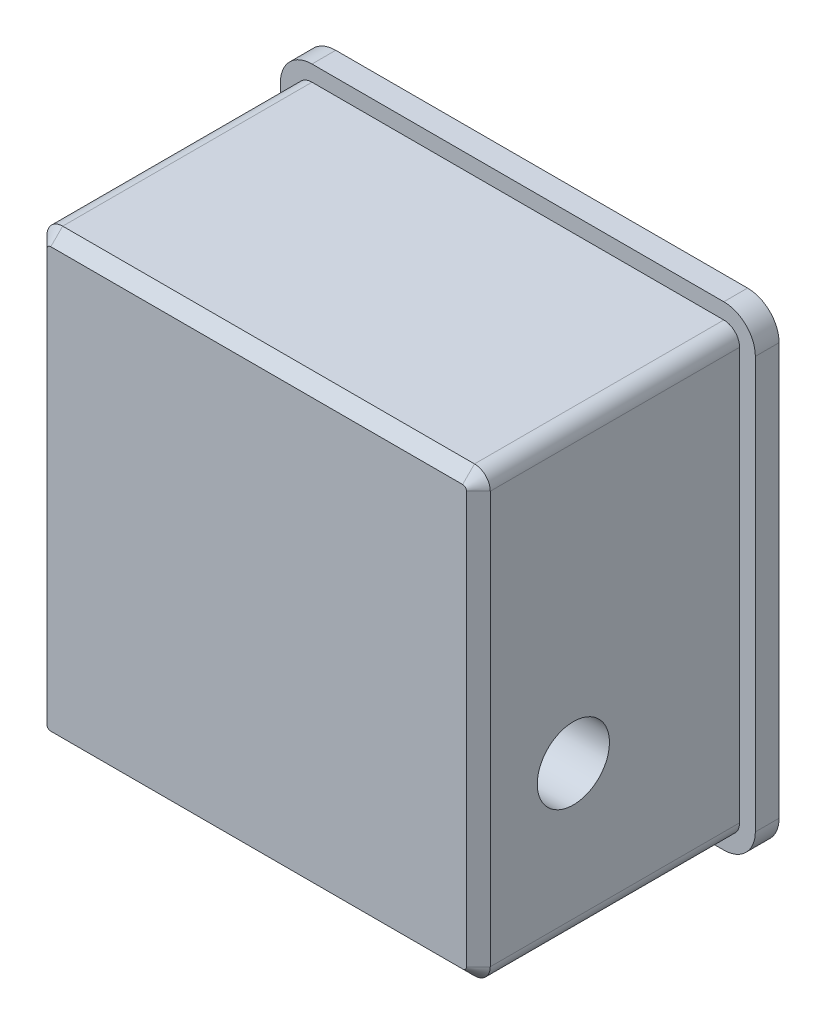
ISO-10303-21;
HEADER;
FILE_DESCRIPTION(('STEP AP214'),'2;1');
FILE_NAME('part.step','',(''),(''),'','','');
FILE_SCHEMA(('AUTOMOTIVE_DESIGN { 1 0 10303 214 1 1 1 1 }'));
ENDSEC;
DATA;
#1=APPLICATION_CONTEXT('core data for automotive mechanical design processes');
#2=APPLICATION_PROTOCOL_DEFINITION('international standard','automotive_design',2000,#1);
#3=PRODUCT_CONTEXT('',#1,'mechanical');
#4=PRODUCT('Part','Part','',(#3));
#5=PRODUCT_RELATED_PRODUCT_CATEGORY('part','',(#4));
#6=PRODUCT_DEFINITION_FORMATION('','',#4);
#7=PRODUCT_DEFINITION_CONTEXT('part definition',#1,'design');
#8=PRODUCT_DEFINITION('design','',#6,#7);
#9=PRODUCT_DEFINITION_SHAPE('','',#8);
#10=(LENGTH_UNIT() NAMED_UNIT(*) SI_UNIT(.MILLI.,.METRE.));
#11=(NAMED_UNIT(*) PLANE_ANGLE_UNIT() SI_UNIT($,.RADIAN.));
#12=(NAMED_UNIT(*) SI_UNIT($,.STERADIAN.) SOLID_ANGLE_UNIT());
#13=UNCERTAINTY_MEASURE_WITH_UNIT(LENGTH_MEASURE(1.E-05),#10,'distance_accuracy_value','');
#14=(GEOMETRIC_REPRESENTATION_CONTEXT(3) GLOBAL_UNCERTAINTY_ASSIGNED_CONTEXT((#13)) GLOBAL_UNIT_ASSIGNED_CONTEXT((#10,
#11,#12)) REPRESENTATION_CONTEXT('',''));
#15=CARTESIAN_POINT('',(0.,0.,0.));
#16=DIRECTION('',(0.,0.,1.));
#17=DIRECTION('',(1.,0.,0.));
#18=AXIS2_PLACEMENT_3D('',#15,#16,#17);
#19=CARTESIAN_POINT('',(27.5336,27.5336,38.1));
#20=DIRECTION('',(0.,0.,-1.));
#21=DIRECTION('',(-1.,0.,0.));
#22=AXIS2_PLACEMENT_3D('',#19,#20,#21);
#23=CYLINDRICAL_SURFACE('',#22,2.1082);
#24=DIRECTION('',(0.,0.,-1.));
#25=VECTOR('',#24,1.);
#26=CARTESIAN_POINT('',(27.5336,29.6418,38.1));
#27=LINE('',#26,#25);
#28=CARTESIAN_POINT('',(27.5336,29.6418,36.5125));
#29=VERTEX_POINT('',#28);
#30=CARTESIAN_POINT('',(27.5336,29.6418,3.175));
#31=VERTEX_POINT('',#30);
#32=EDGE_CURVE('E191',#29,#31,#27,.T.);
#33=ORIENTED_EDGE('',*,*,#32,.F.);
#34=CARTESIAN_POINT('',(27.5336,27.5336,36.5125));
#35=DIRECTION('',(0.,0.,1.));
#36=DIRECTION('',(1.,0.,0.));
#37=AXIS2_PLACEMENT_3D('',#34,#35,#36);
#38=CIRCLE('',#37,2.1082);
#39=CARTESIAN_POINT('',(29.6418,27.5336,36.5125));
#40=VERTEX_POINT('',#39);
#41=EDGE_CURVE('E325',#29,#40,#38,.F.);
#42=ORIENTED_EDGE('',*,*,#41,.T.);
#43=DIRECTION('',(0.,0.,-1.));
#44=VECTOR('',#43,1.);
#45=CARTESIAN_POINT('',(29.6418,27.5336,38.1));
#46=LINE('',#45,#44);
#47=CARTESIAN_POINT('',(29.6418,27.5336,3.17500000000001));
#48=VERTEX_POINT('',#47);
#49=EDGE_CURVE('E215',#40,#48,#46,.T.);
#50=ORIENTED_EDGE('',*,*,#49,.T.);
#51=CARTESIAN_POINT('',(27.5336,27.5336,3.175));
#52=DIRECTION('',(0.,0.,1.));
#53=DIRECTION('',(-1.,0.,0.));
#54=AXIS2_PLACEMENT_3D('',#51,#52,#53);
#55=CIRCLE('',#54,2.1082);
#56=EDGE_CURVE('E208',#48,#31,#55,.T.);
#57=ORIENTED_EDGE('',*,*,#56,.T.);
#58=EDGE_LOOP('',(#33,#42,#50,#57));
#59=FACE_BOUND('',#58,.T.);
#60=ADVANCED_FACE('F51',(#59),#23,.T.);
#61=CARTESIAN_POINT('',(0.,29.6418,38.1));
#62=DIRECTION('',(0.,-1.,0.));
#63=DIRECTION('',(0.,0.,-1.));
#64=AXIS2_PLACEMENT_3D('',#61,#62,#63);
#65=PLANE('',#64);
#66=DIRECTION('',(0.,0.,-1.));
#67=VECTOR('',#66,1.);
#68=CARTESIAN_POINT('',(-27.5336,29.6418,38.1));
#69=LINE('',#68,#67);
#70=CARTESIAN_POINT('',(-27.5336,29.6418,36.5125));
#71=VERTEX_POINT('',#70);
#72=CARTESIAN_POINT('',(-27.5336,29.6418,3.175));
#73=VERTEX_POINT('',#72);
#74=EDGE_CURVE('E201',#71,#73,#69,.T.);
#75=ORIENTED_EDGE('',*,*,#74,.F.);
#76=DIRECTION('',(1.,0.,0.));
#77=VECTOR('',#76,1.);
#78=CARTESIAN_POINT('',(27.5336,29.6418,36.5125));
#79=LINE('',#78,#77);
#80=EDGE_CURVE('E197',#71,#29,#79,.T.);
#81=ORIENTED_EDGE('',*,*,#80,.T.);
#82=ORIENTED_EDGE('',*,*,#32,.T.);
#83=DIRECTION('',(-1.,0.,0.));
#84=VECTOR('',#83,1.);
#85=CARTESIAN_POINT('',(27.5336,29.6418,3.175));
#86=LINE('',#85,#84);
#87=EDGE_CURVE('E195',#31,#73,#86,.T.);
#88=ORIENTED_EDGE('',*,*,#87,.T.);
#89=EDGE_LOOP('',(#75,#81,#82,#88));
#90=FACE_BOUND('',#89,.T.);
#91=ADVANCED_FACE('F194',(#90),#65,.F.);
#92=CARTESIAN_POINT('',(-27.5336,27.5336,38.1));
#93=DIRECTION('',(0.,0.,-1.));
#94=DIRECTION('',(-1.,0.,0.));
#95=AXIS2_PLACEMENT_3D('',#92,#93,#94);
#96=CYLINDRICAL_SURFACE('',#95,2.1082);
#97=DIRECTION('',(0.,0.,-1.));
#98=VECTOR('',#97,1.);
#99=CARTESIAN_POINT('',(-29.6418,27.5336,38.1));
#100=LINE('',#99,#98);
#101=CARTESIAN_POINT('',(-29.6418,27.5336,36.5125));
#102=VERTEX_POINT('',#101);
#103=CARTESIAN_POINT('',(-29.6418,27.5336,3.175));
#104=VERTEX_POINT('',#103);
#105=EDGE_CURVE('E305',#102,#104,#100,.T.);
#106=ORIENTED_EDGE('',*,*,#105,.F.);
#107=CARTESIAN_POINT('',(-27.5336,27.5336,36.5125));
#108=DIRECTION('',(0.,0.,1.));
#109=DIRECTION('',(1.,0.,0.));
#110=AXIS2_PLACEMENT_3D('',#107,#108,#109);
#111=CIRCLE('',#110,2.1082);
#112=EDGE_CURVE('E327',#102,#71,#111,.F.);
#113=ORIENTED_EDGE('',*,*,#112,.T.);
#114=ORIENTED_EDGE('',*,*,#74,.T.);
#115=CARTESIAN_POINT('',(-27.5336,27.5336,3.175));
#116=DIRECTION('',(0.,0.,1.));
#117=DIRECTION('',(1.,0.,0.));
#118=AXIS2_PLACEMENT_3D('',#115,#116,#117);
#119=CIRCLE('',#118,2.1082);
#120=EDGE_CURVE('E212',#73,#104,#119,.T.);
#121=ORIENTED_EDGE('',*,*,#120,.T.);
#122=EDGE_LOOP('',(#106,#113,#114,#121));
#123=FACE_BOUND('',#122,.T.);
#124=ADVANCED_FACE('F402',(#123),#96,.T.);
#125=CARTESIAN_POINT('',(-29.6418,0.,38.1));
#126=DIRECTION('',(1.,0.,0.));
#127=DIRECTION('',(0.,0.,-1.));
#128=AXIS2_PLACEMENT_3D('',#125,#126,#127);
#129=PLANE('',#128);
#130=CARTESIAN_POINT('',(-29.6418,-9.52500000000002,25.4));
#131=DIRECTION('',(1.,0.,0.));
#132=DIRECTION('',(0.,0.,-1.));
#133=AXIS2_PLACEMENT_3D('',#130,#131,#132);
#134=CIRCLE('',#133,4.826);
#135=CARTESIAN_POINT('',(-29.6418,-9.52500000000002,20.574));
#136=VERTEX_POINT('',#135);
#137=EDGE_CURVE('E216',#136,#136,#134,.T.);
#138=ORIENTED_EDGE('',*,*,#137,.T.);
#139=EDGE_LOOP('',(#138));
#140=FACE_BOUND('',#139,.T.);
#141=DIRECTION('',(0.,0.,-1.));
#142=VECTOR('',#141,1.);
#143=CARTESIAN_POINT('',(-29.6418,-27.5336,38.1));
#144=LINE('',#143,#142);
#145=CARTESIAN_POINT('',(-29.6418,-27.5336,36.5125));
#146=VERTEX_POINT('',#145);
#147=CARTESIAN_POINT('',(-29.6418,-27.5336,3.175));
#148=VERTEX_POINT('',#147);
#149=EDGE_CURVE('E303',#146,#148,#144,.T.);
#150=ORIENTED_EDGE('',*,*,#149,.F.);
#151=DIRECTION('',(0.,1.,0.));
#152=VECTOR('',#151,1.);
#153=CARTESIAN_POINT('',(-29.6418,27.5336,36.5125));
#154=LINE('',#153,#152);
#155=EDGE_CURVE('E331',#146,#102,#154,.T.);
#156=ORIENTED_EDGE('',*,*,#155,.T.);
#157=ORIENTED_EDGE('',*,*,#105,.T.);
#158=DIRECTION('',(0.,-1.,0.));
#159=VECTOR('',#158,1.);
#160=CARTESIAN_POINT('',(-29.6418,27.5336,3.175));
#161=LINE('',#160,#159);
#162=EDGE_CURVE('E224',#104,#148,#161,.T.);
#163=ORIENTED_EDGE('',*,*,#162,.T.);
#164=EDGE_LOOP('',(#150,#156,#157,#163));
#165=FACE_BOUND('',#164,.T.);
#166=ADVANCED_FACE('F544',(#140,#165),#129,.F.);
#167=CARTESIAN_POINT('',(-27.5336,-27.5336,38.1));
#168=DIRECTION('',(0.,0.,-1.));
#169=DIRECTION('',(-1.,0.,0.));
#170=AXIS2_PLACEMENT_3D('',#167,#168,#169);
#171=CYLINDRICAL_SURFACE('',#170,2.1082);
#172=DIRECTION('',(0.,0.,-1.));
#173=VECTOR('',#172,1.);
#174=CARTESIAN_POINT('',(-27.5336,-29.6418,38.1));
#175=LINE('',#174,#173);
#176=CARTESIAN_POINT('',(-27.5336,-29.6418,36.5125));
#177=VERTEX_POINT('',#176);
#178=CARTESIAN_POINT('',(-27.5336,-29.6418,3.175));
#179=VERTEX_POINT('',#178);
#180=EDGE_CURVE('E301',#177,#179,#175,.T.);
#181=ORIENTED_EDGE('',*,*,#180,.F.);
#182=CARTESIAN_POINT('',(-27.5336,-27.5336,36.5125));
#183=DIRECTION('',(0.,0.,1.));
#184=DIRECTION('',(1.,0.,0.));
#185=AXIS2_PLACEMENT_3D('',#182,#183,#184);
#186=CIRCLE('',#185,2.1082);
#187=EDGE_CURVE('E61',#177,#146,#186,.F.);
#188=ORIENTED_EDGE('',*,*,#187,.T.);
#189=ORIENTED_EDGE('',*,*,#149,.T.);
#190=CARTESIAN_POINT('',(-27.5336,-27.5336,3.175));
#191=DIRECTION('',(0.,0.,1.));
#192=DIRECTION('',(-1.,0.,0.));
#193=AXIS2_PLACEMENT_3D('',#190,#191,#192);
#194=CIRCLE('',#193,2.1082);
#195=EDGE_CURVE('E227',#148,#179,#194,.T.);
#196=ORIENTED_EDGE('',*,*,#195,.T.);
#197=EDGE_LOOP('',(#181,#188,#189,#196));
#198=FACE_BOUND('',#197,.T.);
#199=ADVANCED_FACE('F537',(#198),#171,.T.);
#200=CARTESIAN_POINT('',(0.,-29.6418,38.1));
#201=DIRECTION('',(0.,-1.,0.));
#202=DIRECTION('',(1.,0.,0.));
#203=AXIS2_PLACEMENT_3D('',#200,#201,#202);
#204=PLANE('',#203);
#205=DIRECTION('',(0.,0.,-1.));
#206=VECTOR('',#205,1.);
#207=CARTESIAN_POINT('',(27.5336,-29.6418,38.1));
#208=LINE('',#207,#206);
#209=CARTESIAN_POINT('',(27.5336,-29.6418,36.5125));
#210=VERTEX_POINT('',#209);
#211=CARTESIAN_POINT('',(27.5336,-29.6418,3.175));
#212=VERTEX_POINT('',#211);
#213=EDGE_CURVE('E299',#210,#212,#208,.T.);
#214=ORIENTED_EDGE('',*,*,#213,.F.);
#215=DIRECTION('',(-1.,0.,0.));
#216=VECTOR('',#215,1.);
#217=CARTESIAN_POINT('',(0.,-29.6418,36.5125));
#218=LINE('',#217,#216);
#219=EDGE_CURVE('E11',#210,#177,#218,.T.);
#220=ORIENTED_EDGE('',*,*,#219,.T.);
#221=ORIENTED_EDGE('',*,*,#180,.T.);
#222=DIRECTION('',(1.,0.,0.));
#223=VECTOR('',#222,1.);
#224=CARTESIAN_POINT('',(27.5336,-29.6418,3.175));
#225=LINE('',#224,#223);
#226=EDGE_CURVE('E230',#179,#212,#225,.T.);
#227=ORIENTED_EDGE('',*,*,#226,.T.);
#228=EDGE_LOOP('',(#214,#220,#221,#227));
#229=FACE_BOUND('',#228,.T.);
#230=ADVANCED_FACE('F530',(#229),#204,.T.);
#231=CARTESIAN_POINT('',(27.5336,-27.5336,38.1));
#232=DIRECTION('',(0.,0.,-1.));
#233=DIRECTION('',(-1.,0.,0.));
#234=AXIS2_PLACEMENT_3D('',#231,#232,#233);
#235=CYLINDRICAL_SURFACE('',#234,2.1082);
#236=DIRECTION('',(0.,0.,-1.));
#237=VECTOR('',#236,1.);
#238=CARTESIAN_POINT('',(29.6418,-27.5336,38.1));
#239=LINE('',#238,#237);
#240=CARTESIAN_POINT('',(29.6418,-27.5336,36.5125));
#241=VERTEX_POINT('',#240);
#242=CARTESIAN_POINT('',(29.6418,-27.5336,3.175));
#243=VERTEX_POINT('',#242);
#244=EDGE_CURVE('E297',#241,#243,#239,.T.);
#245=ORIENTED_EDGE('',*,*,#244,.F.);
#246=CARTESIAN_POINT('',(27.5336,-27.5336,36.5125));
#247=DIRECTION('',(0.,0.,1.));
#248=DIRECTION('',(1.,0.,0.));
#249=AXIS2_PLACEMENT_3D('',#246,#247,#248);
#250=CIRCLE('',#249,2.1082);
#251=EDGE_CURVE('E75',#241,#210,#250,.F.);
#252=ORIENTED_EDGE('',*,*,#251,.T.);
#253=ORIENTED_EDGE('',*,*,#213,.T.);
#254=CARTESIAN_POINT('',(27.5336,-27.5336,3.175));
#255=DIRECTION('',(0.,0.,1.));
#256=DIRECTION('',(-1.,0.,0.));
#257=AXIS2_PLACEMENT_3D('',#254,#255,#256);
#258=CIRCLE('',#257,2.1082);
#259=EDGE_CURVE('E233',#212,#243,#258,.T.);
#260=ORIENTED_EDGE('',*,*,#259,.T.);
#261=EDGE_LOOP('',(#245,#252,#253,#260));
#262=FACE_BOUND('',#261,.T.);
#263=ADVANCED_FACE('F370',(#262),#235,.T.);
#264=CARTESIAN_POINT('',(29.6418,0.,38.1));
#265=DIRECTION('',(1.,0.,0.));
#266=DIRECTION('',(0.,1.,0.));
#267=AXIS2_PLACEMENT_3D('',#264,#265,#266);
#268=PLANE('',#267);
#269=CARTESIAN_POINT('',(29.6418,-9.525,25.4));
#270=DIRECTION('',(1.,0.,0.));
#271=DIRECTION('',(0.,1.,0.));
#272=AXIS2_PLACEMENT_3D('',#269,#270,#271);
#273=CIRCLE('',#272,4.826);
#274=CARTESIAN_POINT('',(29.6418,-4.699,25.4));
#275=VERTEX_POINT('',#274);
#276=EDGE_CURVE('E219',#275,#275,#273,.T.);
#277=ORIENTED_EDGE('',*,*,#276,.F.);
#278=EDGE_LOOP('',(#277));
#279=FACE_BOUND('',#278,.T.);
#280=ORIENTED_EDGE('',*,*,#49,.F.);
#281=DIRECTION('',(0.,-1.,0.));
#282=VECTOR('',#281,1.);
#283=CARTESIAN_POINT('',(29.6418,0.,36.5125));
#284=LINE('',#283,#282);
#285=EDGE_CURVE('E329',#40,#241,#284,.T.);
#286=ORIENTED_EDGE('',*,*,#285,.T.);
#287=ORIENTED_EDGE('',*,*,#244,.T.);
#288=DIRECTION('',(0.,1.,0.));
#289=VECTOR('',#288,1.);
#290=CARTESIAN_POINT('',(29.6418,27.5336,3.175));
#291=LINE('',#290,#289);
#292=EDGE_CURVE('E236',#243,#48,#291,.T.);
#293=ORIENTED_EDGE('',*,*,#292,.T.);
#294=EDGE_LOOP('',(#280,#286,#287,#293));
#295=FACE_BOUND('',#294,.T.);
#296=ADVANCED_FACE('F366',(#279,#295),#268,.T.);
#297=CARTESIAN_POINT('',(0.,0.,38.1));
#298=DIRECTION('',(0.,0.,1.));
#299=DIRECTION('',(1.,0.,0.));
#300=AXIS2_PLACEMENT_3D('',#297,#298,#299);
#301=PLANE('',#300);
#302=CARTESIAN_POINT('',(27.5336,27.5336,38.1));
#303=DIRECTION('',(0.,0.,1.));
#304=DIRECTION('',(1.,0.,0.));
#305=AXIS2_PLACEMENT_3D('',#302,#303,#304);
#306=CIRCLE('',#305,0.520699999999982);
#307=CARTESIAN_POINT('',(28.0543,27.5336,38.1));
#308=VERTEX_POINT('',#307);
#309=CARTESIAN_POINT('',(27.5336,28.0543,38.1));
#310=VERTEX_POINT('',#309);
#311=EDGE_CURVE('E319',#308,#310,#306,.T.);
#312=ORIENTED_EDGE('',*,*,#311,.T.);
#313=DIRECTION('',(-1.,0.,0.));
#314=VECTOR('',#313,1.);
#315=CARTESIAN_POINT('',(-27.5336,28.0543,38.1));
#316=LINE('',#315,#314);
#317=CARTESIAN_POINT('',(-27.5336,28.0543,38.1));
#318=VERTEX_POINT('',#317);
#319=EDGE_CURVE('E321',#310,#318,#316,.T.);
#320=ORIENTED_EDGE('',*,*,#319,.T.);
#321=CARTESIAN_POINT('',(-27.5336,27.5336,38.1));
#322=DIRECTION('',(0.,0.,1.));
#323=DIRECTION('',(1.,0.,0.));
#324=AXIS2_PLACEMENT_3D('',#321,#322,#323);
#325=CIRCLE('',#324,0.520699999999982);
#326=CARTESIAN_POINT('',(-28.0543,27.5336,38.1));
#327=VERTEX_POINT('',#326);
#328=EDGE_CURVE('E317',#318,#327,#325,.T.);
#329=ORIENTED_EDGE('',*,*,#328,.T.);
#330=DIRECTION('',(0.,-1.,0.));
#331=VECTOR('',#330,1.);
#332=CARTESIAN_POINT('',(-28.0543,-27.5336,38.1));
#333=LINE('',#332,#331);
#334=CARTESIAN_POINT('',(-28.0543,-27.5336,38.1));
#335=VERTEX_POINT('',#334);
#336=EDGE_CURVE('E313',#327,#335,#333,.T.);
#337=ORIENTED_EDGE('',*,*,#336,.T.);
#338=CARTESIAN_POINT('',(-27.5336,-27.5336,38.1));
#339=DIRECTION('',(0.,0.,1.));
#340=DIRECTION('',(1.,0.,0.));
#341=AXIS2_PLACEMENT_3D('',#338,#339,#340);
#342=CIRCLE('',#341,0.520699999999982);
#343=CARTESIAN_POINT('',(-27.5336,-28.0543,38.1));
#344=VERTEX_POINT('',#343);
#345=EDGE_CURVE('E309',#335,#344,#342,.T.);
#346=ORIENTED_EDGE('',*,*,#345,.T.);
#347=DIRECTION('',(1.,0.,0.));
#348=VECTOR('',#347,1.);
#349=CARTESIAN_POINT('',(0.,-28.0543,38.1));
#350=LINE('',#349,#348);
#351=CARTESIAN_POINT('',(27.5336,-28.0543,38.1));
#352=VERTEX_POINT('',#351);
#353=EDGE_CURVE('E200',#344,#352,#350,.T.);
#354=ORIENTED_EDGE('',*,*,#353,.T.);
#355=CARTESIAN_POINT('',(27.5336,-27.5336,38.1));
#356=DIRECTION('',(0.,0.,1.));
#357=DIRECTION('',(1.,0.,0.));
#358=AXIS2_PLACEMENT_3D('',#355,#356,#357);
#359=CIRCLE('',#358,0.520699999999982);
#360=CARTESIAN_POINT('',(28.0543,-27.5336,38.1));
#361=VERTEX_POINT('',#360);
#362=EDGE_CURVE('E311',#352,#361,#359,.T.);
#363=ORIENTED_EDGE('',*,*,#362,.T.);
#364=DIRECTION('',(0.,1.,0.));
#365=VECTOR('',#364,1.);
#366=CARTESIAN_POINT('',(28.0543,0.,38.1));
#367=LINE('',#366,#365);
#368=EDGE_CURVE('E315',#361,#308,#367,.T.);
#369=ORIENTED_EDGE('',*,*,#368,.T.);
#370=EDGE_LOOP('',(#312,#320,#329,#337,#346,#354,#363,#369));
#371=FACE_BOUND('',#370,.T.);
#372=ADVANCED_FACE('F369',(#371),#301,.T.);
#373=CARTESIAN_POINT('',(-27.5336,-27.5336,3.175));
#374=DIRECTION('',(0.,0.,-1.));
#375=DIRECTION('',(-1.,0.,0.));
#376=AXIS2_PLACEMENT_3D('',#373,#374,#375);
#377=PLANE('',#376);
#378=CARTESIAN_POINT('',(-27.5336,-27.5336,3.175));
#379=DIRECTION('',(0.,0.,1.));
#380=DIRECTION('',(-1.,0.,0.));
#381=AXIS2_PLACEMENT_3D('',#378,#379,#380);
#382=CIRCLE('',#381,4.2164);
#383=CARTESIAN_POINT('',(-31.75,-27.5336,3.175));
#384=VERTEX_POINT('',#383);
#385=CARTESIAN_POINT('',(-27.5336,-31.75,3.175));
#386=VERTEX_POINT('',#385);
#387=EDGE_CURVE('E239',#384,#386,#382,.T.);
#388=ORIENTED_EDGE('',*,*,#387,.T.);
#389=DIRECTION('',(1.,0.,0.));
#390=VECTOR('',#389,1.);
#391=CARTESIAN_POINT('',(27.5336,-31.75,3.175));
#392=LINE('',#391,#390);
#393=CARTESIAN_POINT('',(27.5336,-31.75,3.175));
#394=VERTEX_POINT('',#393);
#395=EDGE_CURVE('E242',#386,#394,#392,.T.);
#396=ORIENTED_EDGE('',*,*,#395,.T.);
#397=CARTESIAN_POINT('',(27.5336,-27.5336,3.175));
#398=DIRECTION('',(0.,0.,1.));
#399=DIRECTION('',(-1.,0.,0.));
#400=AXIS2_PLACEMENT_3D('',#397,#398,#399);
#401=CIRCLE('',#400,4.2164);
#402=CARTESIAN_POINT('',(31.75,-27.5336,3.175));
#403=VERTEX_POINT('',#402);
#404=EDGE_CURVE('E245',#394,#403,#401,.T.);
#405=ORIENTED_EDGE('',*,*,#404,.T.);
#406=DIRECTION('',(0.,1.,0.));
#407=VECTOR('',#406,1.);
#408=CARTESIAN_POINT('',(31.75,27.5336,3.175));
#409=LINE('',#408,#407);
#410=CARTESIAN_POINT('',(31.75,27.5336,3.175));
#411=VERTEX_POINT('',#410);
#412=EDGE_CURVE('E247',#403,#411,#409,.T.);
#413=ORIENTED_EDGE('',*,*,#412,.T.);
#414=CARTESIAN_POINT('',(27.5336,27.5336,3.175));
#415=DIRECTION('',(0.,0.,1.));
#416=DIRECTION('',(-1.,0.,0.));
#417=AXIS2_PLACEMENT_3D('',#414,#415,#416);
#418=CIRCLE('',#417,4.2164);
#419=CARTESIAN_POINT('',(27.5336,31.75,3.175));
#420=VERTEX_POINT('',#419);
#421=EDGE_CURVE('E249',#411,#420,#418,.T.);
#422=ORIENTED_EDGE('',*,*,#421,.T.);
#423=DIRECTION('',(-1.,0.,0.));
#424=VECTOR('',#423,1.);
#425=CARTESIAN_POINT('',(27.5336,31.75,3.175));
#426=LINE('',#425,#424);
#427=CARTESIAN_POINT('',(-27.5336,31.75,3.175));
#428=VERTEX_POINT('',#427);
#429=EDGE_CURVE('E251',#420,#428,#426,.T.);
#430=ORIENTED_EDGE('',*,*,#429,.T.);
#431=CARTESIAN_POINT('',(-27.5336,27.5336,3.175));
#432=DIRECTION('',(0.,0.,1.));
#433=DIRECTION('',(1.,0.,0.));
#434=AXIS2_PLACEMENT_3D('',#431,#432,#433);
#435=CIRCLE('',#434,4.2164);
#436=CARTESIAN_POINT('',(-31.75,27.5336,3.175));
#437=VERTEX_POINT('',#436);
#438=EDGE_CURVE('E253',#428,#437,#435,.T.);
#439=ORIENTED_EDGE('',*,*,#438,.T.);
#440=DIRECTION('',(0.,-1.,0.));
#441=VECTOR('',#440,1.);
#442=CARTESIAN_POINT('',(-31.75,27.5336,3.175));
#443=LINE('',#442,#441);
#444=EDGE_CURVE('E255',#437,#384,#443,.T.);
#445=ORIENTED_EDGE('',*,*,#444,.T.);
#446=EDGE_LOOP('',(#388,#396,#405,#413,#422,#430,#439,#445));
#447=FACE_BOUND('',#446,.T.);
#448=ORIENTED_EDGE('',*,*,#56,.F.);
#449=ORIENTED_EDGE('',*,*,#292,.F.);
#450=ORIENTED_EDGE('',*,*,#259,.F.);
#451=ORIENTED_EDGE('',*,*,#226,.F.);
#452=ORIENTED_EDGE('',*,*,#195,.F.);
#453=ORIENTED_EDGE('',*,*,#162,.F.);
#454=ORIENTED_EDGE('',*,*,#120,.F.);
#455=ORIENTED_EDGE('',*,*,#87,.F.);
#456=EDGE_LOOP('',(#448,#449,#450,#451,#452,#453,#454,#455));
#457=FACE_BOUND('',#456,.T.);
#458=ADVANCED_FACE('F206',(#447,#457),#377,.F.);
#459=CARTESIAN_POINT('',(-27.5336,-27.5336,3.175));
#460=DIRECTION('',(0.,0.,-1.));
#461=DIRECTION('',(-1.,0.,0.));
#462=AXIS2_PLACEMENT_3D('',#459,#460,#461);
#463=CYLINDRICAL_SURFACE('',#462,4.2164);
#464=CARTESIAN_POINT('',(-27.5336,-27.5336,0.));
#465=DIRECTION('',(0.,0.,1.));
#466=DIRECTION('',(-1.,0.,0.));
#467=AXIS2_PLACEMENT_3D('',#464,#465,#466);
#468=CIRCLE('',#467,4.2164);
#469=CARTESIAN_POINT('',(-31.75,-27.5336,0.));
#470=VERTEX_POINT('',#469);
#471=CARTESIAN_POINT('',(-27.5336,-31.75,0.));
#472=VERTEX_POINT('',#471);
#473=EDGE_CURVE('E238',#470,#472,#468,.T.);
#474=ORIENTED_EDGE('',*,*,#473,.T.);
#475=DIRECTION('',(0.,0.,-1.));
#476=VECTOR('',#475,1.);
#477=CARTESIAN_POINT('',(-27.5336,-31.75,3.175));
#478=LINE('',#477,#476);
#479=EDGE_CURVE('E293',#386,#472,#478,.T.);
#480=ORIENTED_EDGE('',*,*,#479,.F.);
#481=ORIENTED_EDGE('',*,*,#387,.F.);
#482=DIRECTION('',(0.,0.,-1.));
#483=VECTOR('',#482,1.);
#484=CARTESIAN_POINT('',(-31.75,-27.5336,3.175));
#485=LINE('',#484,#483);
#486=EDGE_CURVE('E257',#384,#470,#485,.T.);
#487=ORIENTED_EDGE('',*,*,#486,.T.);
#488=EDGE_LOOP('',(#474,#480,#481,#487));
#489=FACE_BOUND('',#488,.T.);
#490=ADVANCED_FACE('F576',(#489),#463,.T.);
#491=CARTESIAN_POINT('',(27.5336,-31.75,3.175));
#492=DIRECTION('',(0.,1.,0.));
#493=DIRECTION('',(-1.,0.,0.));
#494=AXIS2_PLACEMENT_3D('',#491,#492,#493);
#495=PLANE('',#494);
#496=DIRECTION('',(1.,0.,0.));
#497=VECTOR('',#496,1.);
#498=CARTESIAN_POINT('',(27.5336,-31.75,0.));
#499=LINE('',#498,#497);
#500=CARTESIAN_POINT('',(27.5336,-31.75,0.));
#501=VERTEX_POINT('',#500);
#502=EDGE_CURVE('E260',#472,#501,#499,.T.);
#503=ORIENTED_EDGE('',*,*,#502,.T.);
#504=DIRECTION('',(0.,0.,-1.));
#505=VECTOR('',#504,1.);
#506=CARTESIAN_POINT('',(27.5336,-31.75,3.175));
#507=LINE('',#506,#505);
#508=EDGE_CURVE('E290',#394,#501,#507,.T.);
#509=ORIENTED_EDGE('',*,*,#508,.F.);
#510=ORIENTED_EDGE('',*,*,#395,.F.);
#511=ORIENTED_EDGE('',*,*,#479,.T.);
#512=EDGE_LOOP('',(#503,#509,#510,#511));
#513=FACE_BOUND('',#512,.T.);
#514=ADVANCED_FACE('F585',(#513),#495,.F.);
#515=CARTESIAN_POINT('',(27.5336,-27.5336,3.175));
#516=DIRECTION('',(0.,0.,-1.));
#517=DIRECTION('',(-1.,0.,0.));
#518=AXIS2_PLACEMENT_3D('',#515,#516,#517);
#519=CYLINDRICAL_SURFACE('',#518,4.2164);
#520=CARTESIAN_POINT('',(27.5336,-27.5336,0.));
#521=DIRECTION('',(0.,0.,1.));
#522=DIRECTION('',(-1.,0.,0.));
#523=AXIS2_PLACEMENT_3D('',#520,#521,#522);
#524=CIRCLE('',#523,4.2164);
#525=CARTESIAN_POINT('',(31.75,-27.5336,0.));
#526=VERTEX_POINT('',#525);
#527=EDGE_CURVE('E262',#501,#526,#524,.T.);
#528=ORIENTED_EDGE('',*,*,#527,.T.);
#529=DIRECTION('',(0.,0.,-1.));
#530=VECTOR('',#529,1.);
#531=CARTESIAN_POINT('',(31.75,-27.5336,3.175));
#532=LINE('',#531,#530);
#533=EDGE_CURVE('E287',#403,#526,#532,.T.);
#534=ORIENTED_EDGE('',*,*,#533,.F.);
#535=ORIENTED_EDGE('',*,*,#404,.F.);
#536=ORIENTED_EDGE('',*,*,#508,.T.);
#537=EDGE_LOOP('',(#528,#534,#535,#536));
#538=FACE_BOUND('',#537,.T.);
#539=ADVANCED_FACE('F594',(#538),#519,.T.);
#540=CARTESIAN_POINT('',(31.75,27.5336,3.175));
#541=DIRECTION('',(-1.,0.,0.));
#542=DIRECTION('',(0.,-1.,0.));
#543=AXIS2_PLACEMENT_3D('',#540,#541,#542);
#544=PLANE('',#543);
#545=DIRECTION('',(0.,1.,0.));
#546=VECTOR('',#545,1.);
#547=CARTESIAN_POINT('',(31.75,27.5336,0.));
#548=LINE('',#547,#546);
#549=CARTESIAN_POINT('',(31.75,27.5336,0.));
#550=VERTEX_POINT('',#549);
#551=EDGE_CURVE('E264',#526,#550,#548,.T.);
#552=ORIENTED_EDGE('',*,*,#551,.T.);
#553=DIRECTION('',(0.,0.,-1.));
#554=VECTOR('',#553,1.);
#555=CARTESIAN_POINT('',(31.75,27.5336,3.175));
#556=LINE('',#555,#554);
#557=EDGE_CURVE('E284',#411,#550,#556,.T.);
#558=ORIENTED_EDGE('',*,*,#557,.F.);
#559=ORIENTED_EDGE('',*,*,#412,.F.);
#560=ORIENTED_EDGE('',*,*,#533,.T.);
#561=EDGE_LOOP('',(#552,#558,#559,#560));
#562=FACE_BOUND('',#561,.T.);
#563=ADVANCED_FACE('F603',(#562),#544,.F.);
#564=CARTESIAN_POINT('',(27.5336,27.5336,3.175));
#565=DIRECTION('',(0.,0.,-1.));
#566=DIRECTION('',(-1.,0.,0.));
#567=AXIS2_PLACEMENT_3D('',#564,#565,#566);
#568=CYLINDRICAL_SURFACE('',#567,4.2164);
#569=CARTESIAN_POINT('',(27.5336,27.5336,0.));
#570=DIRECTION('',(0.,0.,1.));
#571=DIRECTION('',(-1.,0.,0.));
#572=AXIS2_PLACEMENT_3D('',#569,#570,#571);
#573=CIRCLE('',#572,4.2164);
#574=CARTESIAN_POINT('',(27.5336,31.75,0.));
#575=VERTEX_POINT('',#574);
#576=EDGE_CURVE('E266',#550,#575,#573,.T.);
#577=ORIENTED_EDGE('',*,*,#576,.T.);
#578=DIRECTION('',(0.,0.,-1.));
#579=VECTOR('',#578,1.);
#580=CARTESIAN_POINT('',(27.5336,31.75,3.175));
#581=LINE('',#580,#579);
#582=EDGE_CURVE('E281',#420,#575,#581,.T.);
#583=ORIENTED_EDGE('',*,*,#582,.F.);
#584=ORIENTED_EDGE('',*,*,#421,.F.);
#585=ORIENTED_EDGE('',*,*,#557,.T.);
#586=EDGE_LOOP('',(#577,#583,#584,#585));
#587=FACE_BOUND('',#586,.T.);
#588=ADVANCED_FACE('F612',(#587),#568,.T.);
#589=CARTESIAN_POINT('',(27.5336,31.75,3.175));
#590=DIRECTION('',(0.,-1.,0.));
#591=DIRECTION('',(1.,0.,0.));
#592=AXIS2_PLACEMENT_3D('',#589,#590,#591);
#593=PLANE('',#592);
#594=DIRECTION('',(-1.,0.,0.));
#595=VECTOR('',#594,1.);
#596=CARTESIAN_POINT('',(27.5336,31.75,0.));
#597=LINE('',#596,#595);
#598=CARTESIAN_POINT('',(-27.5336,31.75,0.));
#599=VERTEX_POINT('',#598);
#600=EDGE_CURVE('E268',#575,#599,#597,.T.);
#601=ORIENTED_EDGE('',*,*,#600,.T.);
#602=DIRECTION('',(0.,0.,-1.));
#603=VECTOR('',#602,1.);
#604=CARTESIAN_POINT('',(-27.5336,31.75,3.175));
#605=LINE('',#604,#603);
#606=EDGE_CURVE('E278',#428,#599,#605,.T.);
#607=ORIENTED_EDGE('',*,*,#606,.F.);
#608=ORIENTED_EDGE('',*,*,#429,.F.);
#609=ORIENTED_EDGE('',*,*,#582,.T.);
#610=EDGE_LOOP('',(#601,#607,#608,#609));
#611=FACE_BOUND('',#610,.T.);
#612=ADVANCED_FACE('F621',(#611),#593,.F.);
#613=CARTESIAN_POINT('',(-27.5336,27.5336,3.175));
#614=DIRECTION('',(0.,0.,-1.));
#615=DIRECTION('',(-1.,0.,0.));
#616=AXIS2_PLACEMENT_3D('',#613,#614,#615);
#617=CYLINDRICAL_SURFACE('',#616,4.2164);
#618=CARTESIAN_POINT('',(-27.5336,27.5336,0.));
#619=DIRECTION('',(0.,0.,1.));
#620=DIRECTION('',(1.,0.,0.));
#621=AXIS2_PLACEMENT_3D('',#618,#619,#620);
#622=CIRCLE('',#621,4.2164);
#623=CARTESIAN_POINT('',(-31.75,27.5336,0.));
#624=VERTEX_POINT('',#623);
#625=EDGE_CURVE('E270',#599,#624,#622,.T.);
#626=ORIENTED_EDGE('',*,*,#625,.T.);
#627=DIRECTION('',(0.,0.,-1.));
#628=VECTOR('',#627,1.);
#629=CARTESIAN_POINT('',(-31.75,27.5336,3.175));
#630=LINE('',#629,#628);
#631=EDGE_CURVE('E275',#437,#624,#630,.T.);
#632=ORIENTED_EDGE('',*,*,#631,.F.);
#633=ORIENTED_EDGE('',*,*,#438,.F.);
#634=ORIENTED_EDGE('',*,*,#606,.T.);
#635=EDGE_LOOP('',(#626,#632,#633,#634));
#636=FACE_BOUND('',#635,.T.);
#637=ADVANCED_FACE('F630',(#636),#617,.T.);
#638=CARTESIAN_POINT('',(-31.75,27.5336,3.175));
#639=DIRECTION('',(1.,0.,0.));
#640=DIRECTION('',(0.,0.,-1.));
#641=AXIS2_PLACEMENT_3D('',#638,#639,#640);
#642=PLANE('',#641);
#643=DIRECTION('',(0.,-1.,0.));
#644=VECTOR('',#643,1.);
#645=CARTESIAN_POINT('',(-31.75,27.5336,0.));
#646=LINE('',#645,#644);
#647=EDGE_CURVE('E243',#624,#470,#646,.T.);
#648=ORIENTED_EDGE('',*,*,#647,.T.);
#649=ORIENTED_EDGE('',*,*,#486,.F.);
#650=ORIENTED_EDGE('',*,*,#444,.F.);
#651=ORIENTED_EDGE('',*,*,#631,.T.);
#652=EDGE_LOOP('',(#648,#649,#650,#651));
#653=FACE_BOUND('',#652,.T.);
#654=ADVANCED_FACE('F639',(#653),#642,.F.);
#655=CARTESIAN_POINT('',(0.,0.,0.));
#656=DIRECTION('',(0.,0.,1.));
#657=DIRECTION('',(1.,0.,0.));
#658=AXIS2_PLACEMENT_3D('',#655,#656,#657);
#659=PLANE('',#658);
#660=ORIENTED_EDGE('',*,*,#473,.F.);
#661=ORIENTED_EDGE('',*,*,#647,.F.);
#662=ORIENTED_EDGE('',*,*,#625,.F.);
#663=ORIENTED_EDGE('',*,*,#600,.F.);
#664=ORIENTED_EDGE('',*,*,#576,.F.);
#665=ORIENTED_EDGE('',*,*,#551,.F.);
#666=ORIENTED_EDGE('',*,*,#527,.F.);
#667=ORIENTED_EDGE('',*,*,#502,.F.);
#668=EDGE_LOOP('',(#660,#661,#662,#663,#664,#665,#666,#667));
#669=FACE_BOUND('',#668,.T.);
#670=ADVANCED_FACE('F648',(#669),#659,.F.);
#671=CARTESIAN_POINT('',(-31.75,-9.52500000000002,25.4));
#672=DIRECTION('',(1.,0.,0.));
#673=DIRECTION('',(0.,1.,0.));
#674=AXIS2_PLACEMENT_3D('',#671,#672,#673);
#675=CYLINDRICAL_SURFACE('',#674,4.826);
#676=ORIENTED_EDGE('',*,*,#276,.T.);
#677=EDGE_LOOP('',(#676));
#678=FACE_BOUND('',#677,.T.);
#679=ORIENTED_EDGE('',*,*,#137,.F.);
#680=EDGE_LOOP('',(#679));
#681=FACE_BOUND('',#680,.T.);
#682=ADVANCED_FACE('F363',(#678,#681),#675,.F.);
#683=CARTESIAN_POINT('',(0.,-29.6418,36.5125));
#684=DIRECTION('',(0.,0.707106781186548,-0.707106781186548));
#685=DIRECTION('',(-1.,0.,0.));
#686=AXIS2_PLACEMENT_3D('',#683,#684,#685);
#687=PLANE('',#686);
#688=DIRECTION('',(0.,0.707106781186548,0.707106781186548));
#689=VECTOR('',#688,1.);
#690=CARTESIAN_POINT('',(-27.5336,-29.6418,36.5125));
#691=LINE('',#690,#689);
#692=EDGE_CURVE('E350',#177,#344,#691,.T.);
#693=ORIENTED_EDGE('',*,*,#692,.F.);
#694=ORIENTED_EDGE('',*,*,#219,.F.);
#695=DIRECTION('',(0.,-0.707106781186548,-0.707106781186548));
#696=VECTOR('',#695,1.);
#697=CARTESIAN_POINT('',(27.5336,-28.0543,38.1));
#698=LINE('',#697,#696);
#699=EDGE_CURVE('E56',#352,#210,#698,.T.);
#700=ORIENTED_EDGE('',*,*,#699,.F.);
#701=ORIENTED_EDGE('',*,*,#353,.F.);
#702=EDGE_LOOP('',(#693,#694,#700,#701));
#703=FACE_BOUND('',#702,.T.);
#704=ADVANCED_FACE('F54',(#703),#687,.F.);
#705=CARTESIAN_POINT('',(27.5336,-27.5336,36.5125));
#706=DIRECTION('',(0.,0.,-1.));
#707=DIRECTION('',(-1.,0.,0.));
#708=AXIS2_PLACEMENT_3D('',#705,#706,#707);
#709=CONICAL_SURFACE('',#708,2.1082,0.785398163397448);
#710=ORIENTED_EDGE('',*,*,#699,.T.);
#711=ORIENTED_EDGE('',*,*,#251,.F.);
#712=DIRECTION('',(0.707106781186548,0.,-0.707106781186548));
#713=VECTOR('',#712,1.);
#714=CARTESIAN_POINT('',(28.0543,-27.5336,38.1));
#715=LINE('',#714,#713);
#716=EDGE_CURVE('E348',#361,#241,#715,.T.);
#717=ORIENTED_EDGE('',*,*,#716,.F.);
#718=ORIENTED_EDGE('',*,*,#362,.F.);
#719=EDGE_LOOP('',(#710,#711,#717,#718));
#720=FACE_BOUND('',#719,.T.);
#721=ADVANCED_FACE('F386',(#720),#709,.T.);
#722=CARTESIAN_POINT('',(-27.5336,-27.5336,36.5125));
#723=DIRECTION('',(0.,0.,-1.));
#724=DIRECTION('',(-1.,0.,0.));
#725=AXIS2_PLACEMENT_3D('',#722,#723,#724);
#726=CONICAL_SURFACE('',#725,2.1082,0.785398163397448);
#727=ORIENTED_EDGE('',*,*,#692,.T.);
#728=ORIENTED_EDGE('',*,*,#345,.F.);
#729=DIRECTION('',(0.707106781186548,0.,0.707106781186548));
#730=VECTOR('',#729,1.);
#731=CARTESIAN_POINT('',(-29.6418,-27.5336,36.5125));
#732=LINE('',#731,#730);
#733=EDGE_CURVE('E345',#146,#335,#732,.T.);
#734=ORIENTED_EDGE('',*,*,#733,.F.);
#735=ORIENTED_EDGE('',*,*,#187,.F.);
#736=EDGE_LOOP('',(#727,#728,#734,#735));
#737=FACE_BOUND('',#736,.T.);
#738=ADVANCED_FACE('F388',(#737),#726,.T.);
#739=CARTESIAN_POINT('',(29.6418,0.,36.5125));
#740=DIRECTION('',(-0.707106781186548,0.,-0.707106781186548));
#741=DIRECTION('',(0.,-1.,0.));
#742=AXIS2_PLACEMENT_3D('',#739,#740,#741);
#743=PLANE('',#742);
#744=ORIENTED_EDGE('',*,*,#716,.T.);
#745=ORIENTED_EDGE('',*,*,#285,.F.);
#746=DIRECTION('',(0.707106781186548,0.,-0.707106781186548));
#747=VECTOR('',#746,1.);
#748=CARTESIAN_POINT('',(28.0543,27.5336,38.1));
#749=LINE('',#748,#747);
#750=EDGE_CURVE('E342',#308,#40,#749,.T.);
#751=ORIENTED_EDGE('',*,*,#750,.F.);
#752=ORIENTED_EDGE('',*,*,#368,.F.);
#753=EDGE_LOOP('',(#744,#745,#751,#752));
#754=FACE_BOUND('',#753,.T.);
#755=ADVANCED_FACE('F375',(#754),#743,.F.);
#756=CARTESIAN_POINT('',(-28.0543,0.,38.1));
#757=DIRECTION('',(-0.707106781186548,0.,0.707106781186548));
#758=DIRECTION('',(0.,1.,0.));
#759=AXIS2_PLACEMENT_3D('',#756,#757,#758);
#760=PLANE('',#759);
#761=ORIENTED_EDGE('',*,*,#733,.T.);
#762=ORIENTED_EDGE('',*,*,#336,.F.);
#763=DIRECTION('',(0.707106781186548,0.,0.707106781186548));
#764=VECTOR('',#763,1.);
#765=CARTESIAN_POINT('',(-29.6418,27.5336,36.5125));
#766=LINE('',#765,#764);
#767=EDGE_CURVE('E339',#102,#327,#766,.T.);
#768=ORIENTED_EDGE('',*,*,#767,.F.);
#769=ORIENTED_EDGE('',*,*,#155,.F.);
#770=EDGE_LOOP('',(#761,#762,#768,#769));
#771=FACE_BOUND('',#770,.T.);
#772=ADVANCED_FACE('F426',(#771),#760,.T.);
#773=CARTESIAN_POINT('',(27.5336,27.5336,36.5125));
#774=DIRECTION('',(0.,0.,-1.));
#775=DIRECTION('',(-1.,0.,0.));
#776=AXIS2_PLACEMENT_3D('',#773,#774,#775);
#777=CONICAL_SURFACE('',#776,2.1082,0.785398163397448);
#778=ORIENTED_EDGE('',*,*,#750,.T.);
#779=ORIENTED_EDGE('',*,*,#41,.F.);
#780=DIRECTION('',(0.,0.707106781186548,-0.707106781186548));
#781=VECTOR('',#780,1.);
#782=CARTESIAN_POINT('',(27.5336,28.0543,38.1));
#783=LINE('',#782,#781);
#784=EDGE_CURVE('E337',#310,#29,#783,.T.);
#785=ORIENTED_EDGE('',*,*,#784,.F.);
#786=ORIENTED_EDGE('',*,*,#311,.F.);
#787=EDGE_LOOP('',(#778,#779,#785,#786));
#788=FACE_BOUND('',#787,.T.);
#789=ADVANCED_FACE('F381',(#788),#777,.T.);
#790=CARTESIAN_POINT('',(-27.5336,27.5336,38.1));
#791=DIRECTION('',(0.,0.,-1.));
#792=DIRECTION('',(-1.,0.,0.));
#793=AXIS2_PLACEMENT_3D('',#790,#791,#792);
#794=CONICAL_SURFACE('',#793,0.520699999999982,0.785398163397449);
#795=ORIENTED_EDGE('',*,*,#767,.T.);
#796=ORIENTED_EDGE('',*,*,#328,.F.);
#797=DIRECTION('',(0.,-0.707106781186548,0.707106781186547));
#798=VECTOR('',#797,1.);
#799=CARTESIAN_POINT('',(-27.5336,29.6418,36.5125));
#800=LINE('',#799,#798);
#801=EDGE_CURVE('E335',#71,#318,#800,.T.);
#802=ORIENTED_EDGE('',*,*,#801,.F.);
#803=ORIENTED_EDGE('',*,*,#112,.F.);
#804=EDGE_LOOP('',(#795,#796,#802,#803));
#805=FACE_BOUND('',#804,.T.);
#806=ADVANCED_FACE('F413',(#805),#794,.T.);
#807=CARTESIAN_POINT('',(0.,28.0543,38.1));
#808=DIRECTION('',(0.,0.707106781186548,0.707106781186548));
#809=DIRECTION('',(1.,0.,0.));
#810=AXIS2_PLACEMENT_3D('',#807,#808,#809);
#811=PLANE('',#810);
#812=ORIENTED_EDGE('',*,*,#784,.T.);
#813=ORIENTED_EDGE('',*,*,#80,.F.);
#814=ORIENTED_EDGE('',*,*,#801,.T.);
#815=ORIENTED_EDGE('',*,*,#319,.F.);
#816=EDGE_LOOP('',(#812,#813,#814,#815));
#817=FACE_BOUND('',#816,.T.);
#818=ADVANCED_FACE('F407',(#817),#811,.T.);
#819=CLOSED_SHELL('',(#60,#91,#124,#166,#199,#230,#263,#296,#372,#458,#490,#514,#539,#563,#588,
#612,#637,#654,#670,#682,#704,#721,#738,#755,#772,#789,#806,#818));
#820=MANIFOLD_SOLID_BREP('B2',#819);
#821=ADVANCED_BREP_SHAPE_REPRESENTATION('',(#18,#820),#14);
#822=SHAPE_DEFINITION_REPRESENTATION(#9,#821);
ENDSEC;
END-ISO-10303-21;
